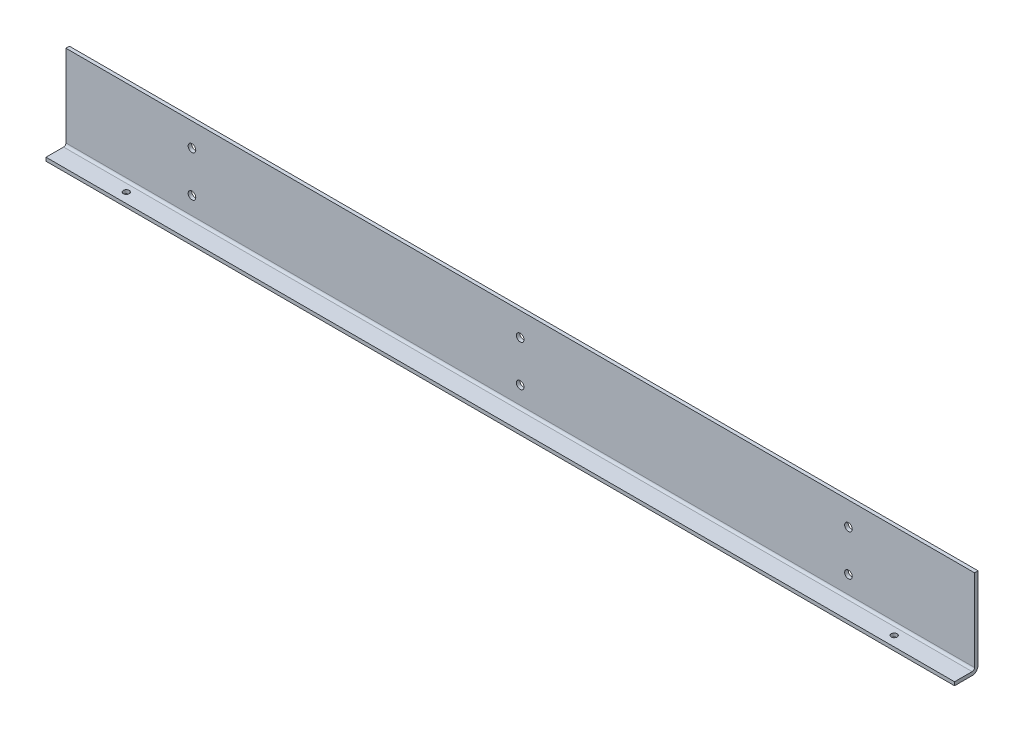
ISO-10303-21;
HEADER;
FILE_DESCRIPTION(('STEP AP214'),'2;1');
FILE_NAME('part.step','',(''),(''),'','','');
FILE_SCHEMA(('AUTOMOTIVE_DESIGN { 1 0 10303 214 1 1 1 1 }'));
ENDSEC;
DATA;
#1=APPLICATION_CONTEXT('core data for automotive mechanical design processes');
#2=APPLICATION_PROTOCOL_DEFINITION('international standard','automotive_design',2000,#1);
#3=PRODUCT_CONTEXT('',#1,'mechanical');
#4=PRODUCT('Part','Part','',(#3));
#5=PRODUCT_RELATED_PRODUCT_CATEGORY('part','',(#4));
#6=PRODUCT_DEFINITION_FORMATION('','',#4);
#7=PRODUCT_DEFINITION_CONTEXT('part definition',#1,'design');
#8=PRODUCT_DEFINITION('design','',#6,#7);
#9=PRODUCT_DEFINITION_SHAPE('','',#8);
#10=(LENGTH_UNIT() NAMED_UNIT(*) SI_UNIT(.MILLI.,.METRE.));
#11=(NAMED_UNIT(*) PLANE_ANGLE_UNIT() SI_UNIT($,.RADIAN.));
#12=(NAMED_UNIT(*) SI_UNIT($,.STERADIAN.) SOLID_ANGLE_UNIT());
#13=UNCERTAINTY_MEASURE_WITH_UNIT(LENGTH_MEASURE(1.E-05),#10,'distance_accuracy_value','');
#14=(GEOMETRIC_REPRESENTATION_CONTEXT(3) GLOBAL_UNCERTAINTY_ASSIGNED_CONTEXT((#13)) GLOBAL_UNIT_ASSIGNED_CONTEXT((#10,
#11,#12)) REPRESENTATION_CONTEXT('',''));
#15=CARTESIAN_POINT('',(0.,0.,0.));
#16=DIRECTION('',(0.,0.,1.));
#17=DIRECTION('',(1.,0.,0.));
#18=AXIS2_PLACEMENT_3D('',#15,#16,#17);
#19=CARTESIAN_POINT('',(0.,0.,3.));
#20=DIRECTION('',(1.,0.,0.));
#21=DIRECTION('',(0.,0.,-1.));
#22=AXIS2_PLACEMENT_3D('',#19,#20,#21);
#23=PLANE('',#22);
#24=DIRECTION('',(0.,-1.,0.));
#25=VECTOR('',#24,1.);
#26=CARTESIAN_POINT('',(0.,0.,0.));
#27=LINE('',#26,#25);
#28=CARTESIAN_POINT('',(0.,75.,0.));
#29=VERTEX_POINT('',#28);
#30=CARTESIAN_POINT('',(0.,5.,0.));
#31=VERTEX_POINT('',#30);
#32=EDGE_CURVE('E153',#29,#31,#27,.T.);
#33=ORIENTED_EDGE('',*,*,#32,.T.);
#34=CARTESIAN_POINT('',(0.,5.,5.));
#35=DIRECTION('',(1.,0.,0.));
#36=DIRECTION('',(0.,0.,-1.));
#37=AXIS2_PLACEMENT_3D('',#34,#35,#36);
#38=CIRCLE('',#37,5.);
#39=CARTESIAN_POINT('',(0.,0.,5.));
#40=VERTEX_POINT('',#39);
#41=EDGE_CURVE('E113',#31,#40,#38,.F.);
#42=ORIENTED_EDGE('',*,*,#41,.T.);
#43=DIRECTION('',(0.,0.,-1.));
#44=VECTOR('',#43,1.);
#45=CARTESIAN_POINT('',(0.,0.,3.));
#46=LINE('',#45,#44);
#47=CARTESIAN_POINT('',(0.,0.,20.));
#48=VERTEX_POINT('',#47);
#49=EDGE_CURVE('E108',#48,#40,#46,.T.);
#50=ORIENTED_EDGE('',*,*,#49,.F.);
#51=DIRECTION('',(0.,1.,0.));
#52=VECTOR('',#51,1.);
#53=CARTESIAN_POINT('',(0.,0.,20.));
#54=LINE('',#53,#52);
#55=CARTESIAN_POINT('',(0.,3.,20.));
#56=VERTEX_POINT('',#55);
#57=EDGE_CURVE('E111',#48,#56,#54,.T.);
#58=ORIENTED_EDGE('',*,*,#57,.T.);
#59=DIRECTION('',(0.,0.,-1.));
#60=VECTOR('',#59,1.);
#61=CARTESIAN_POINT('',(0.,3.,20.));
#62=LINE('',#61,#60);
#63=CARTESIAN_POINT('',(0.,3.,5.));
#64=VERTEX_POINT('',#63);
#65=EDGE_CURVE('E149',#56,#64,#62,.T.);
#66=ORIENTED_EDGE('',*,*,#65,.T.);
#67=CARTESIAN_POINT('',(0.,5.,5.));
#68=DIRECTION('',(1.,0.,0.));
#69=DIRECTION('',(0.,0.,-1.));
#70=AXIS2_PLACEMENT_3D('',#67,#68,#69);
#71=CIRCLE('',#70,2.);
#72=CARTESIAN_POINT('',(0.,5.,3.));
#73=VERTEX_POINT('',#72);
#74=EDGE_CURVE('E11',#64,#73,#71,.T.);
#75=ORIENTED_EDGE('',*,*,#74,.T.);
#76=DIRECTION('',(0.,-1.,0.));
#77=VECTOR('',#76,1.);
#78=CARTESIAN_POINT('',(0.,0.,3.));
#79=LINE('',#78,#77);
#80=CARTESIAN_POINT('',(0.,75.,3.));
#81=VERTEX_POINT('',#80);
#82=EDGE_CURVE('E156',#81,#73,#79,.T.);
#83=ORIENTED_EDGE('',*,*,#82,.F.);
#84=DIRECTION('',(0.,0.,-1.));
#85=VECTOR('',#84,1.);
#86=CARTESIAN_POINT('',(0.,75.,3.));
#87=LINE('',#86,#85);
#88=EDGE_CURVE('E167',#81,#29,#87,.T.);
#89=ORIENTED_EDGE('',*,*,#88,.T.);
#90=EDGE_LOOP('',(#33,#42,#50,#58,#66,#75,#83,#89));
#91=FACE_BOUND('',#90,.T.);
#92=ADVANCED_FACE('F44',(#91),#23,.F.);
#93=CARTESIAN_POINT('',(0.,0.,3.));
#94=DIRECTION('',(0.,1.,0.));
#95=DIRECTION('',(0.,0.,1.));
#96=AXIS2_PLACEMENT_3D('',#93,#94,#95);
#97=PLANE('',#96);
#98=CARTESIAN_POINT('',(60.,0.,11.5));
#99=DIRECTION('',(0.,1.,0.));
#100=DIRECTION('',(0.,0.,1.));
#101=AXIS2_PLACEMENT_3D('',#98,#99,#100);
#102=CIRCLE('',#101,2.5);
#103=CARTESIAN_POINT('',(60.,0.,14.));
#104=VERTEX_POINT('',#103);
#105=EDGE_CURVE('E443',#104,#104,#102,.T.);
#106=ORIENTED_EDGE('',*,*,#105,.T.);
#107=EDGE_LOOP('',(#106));
#108=FACE_BOUND('',#107,.T.);
#109=CARTESIAN_POINT('',(715.,0.,11.5));
#110=DIRECTION('',(0.,1.,0.));
#111=DIRECTION('',(0.,0.,1.));
#112=AXIS2_PLACEMENT_3D('',#109,#110,#111);
#113=CIRCLE('',#112,2.49999999999991);
#114=CARTESIAN_POINT('',(715.,0.,13.9999999999999));
#115=VERTEX_POINT('',#114);
#116=EDGE_CURVE('E445',#115,#115,#113,.T.);
#117=ORIENTED_EDGE('',*,*,#116,.T.);
#118=EDGE_LOOP('',(#117));
#119=FACE_BOUND('',#118,.T.);
#120=ORIENTED_EDGE('',*,*,#49,.T.);
#121=DIRECTION('',(1.,0.,0.));
#122=VECTOR('',#121,1.);
#123=CARTESIAN_POINT('',(775.,0.,5.));
#124=LINE('',#123,#122);
#125=CARTESIAN_POINT('',(775.,0.,5.));
#126=VERTEX_POINT('',#125);
#127=EDGE_CURVE('E119',#40,#126,#124,.T.);
#128=ORIENTED_EDGE('',*,*,#127,.T.);
#129=DIRECTION('',(0.,0.,-1.));
#130=VECTOR('',#129,1.);
#131=CARTESIAN_POINT('',(775.,0.,3.));
#132=LINE('',#131,#130);
#133=CARTESIAN_POINT('',(775.,0.,20.));
#134=VERTEX_POINT('',#133);
#135=EDGE_CURVE('E120',#134,#126,#132,.T.);
#136=ORIENTED_EDGE('',*,*,#135,.F.);
#137=DIRECTION('',(-1.,0.,0.));
#138=VECTOR('',#137,1.);
#139=CARTESIAN_POINT('',(0.,0.,20.));
#140=LINE('',#139,#138);
#141=EDGE_CURVE('E127',#134,#48,#140,.T.);
#142=ORIENTED_EDGE('',*,*,#141,.T.);
#143=EDGE_LOOP('',(#120,#128,#136,#142));
#144=FACE_BOUND('',#143,.T.);
#145=ADVANCED_FACE('F133',(#108,#119,#144),#97,.F.);
#146=CARTESIAN_POINT('',(775.,0.,3.));
#147=DIRECTION('',(-1.,0.,0.));
#148=DIRECTION('',(0.,0.,1.));
#149=AXIS2_PLACEMENT_3D('',#146,#147,#148);
#150=PLANE('',#149);
#151=ORIENTED_EDGE('',*,*,#135,.T.);
#152=CARTESIAN_POINT('',(775.,5.,5.));
#153=DIRECTION('',(-1.,0.,0.));
#154=DIRECTION('',(0.,0.,1.));
#155=AXIS2_PLACEMENT_3D('',#152,#153,#154);
#156=CIRCLE('',#155,5.);
#157=CARTESIAN_POINT('',(775.,5.,0.));
#158=VERTEX_POINT('',#157);
#159=EDGE_CURVE('E186',#126,#158,#156,.F.);
#160=ORIENTED_EDGE('',*,*,#159,.T.);
#161=DIRECTION('',(0.,1.,0.));
#162=VECTOR('',#161,1.);
#163=CARTESIAN_POINT('',(775.,0.,0.));
#164=LINE('',#163,#162);
#165=CARTESIAN_POINT('',(775.,75.,0.));
#166=VERTEX_POINT('',#165);
#167=EDGE_CURVE('E170',#158,#166,#164,.T.);
#168=ORIENTED_EDGE('',*,*,#167,.T.);
#169=DIRECTION('',(0.,0.,-1.));
#170=VECTOR('',#169,1.);
#171=CARTESIAN_POINT('',(775.,75.,3.));
#172=LINE('',#171,#170);
#173=CARTESIAN_POINT('',(775.,75.,3.));
#174=VERTEX_POINT('',#173);
#175=EDGE_CURVE('E178',#174,#166,#172,.T.);
#176=ORIENTED_EDGE('',*,*,#175,.F.);
#177=DIRECTION('',(0.,1.,0.));
#178=VECTOR('',#177,1.);
#179=CARTESIAN_POINT('',(775.,0.,3.));
#180=LINE('',#179,#178);
#181=CARTESIAN_POINT('',(775.,5.,3.));
#182=VERTEX_POINT('',#181);
#183=EDGE_CURVE('E160',#182,#174,#180,.T.);
#184=ORIENTED_EDGE('',*,*,#183,.F.);
#185=CARTESIAN_POINT('',(775.,5.,5.));
#186=DIRECTION('',(-1.,0.,0.));
#187=DIRECTION('',(0.,0.,1.));
#188=AXIS2_PLACEMENT_3D('',#185,#186,#187);
#189=CIRCLE('',#188,2.);
#190=CARTESIAN_POINT('',(775.,3.,5.));
#191=VERTEX_POINT('',#190);
#192=EDGE_CURVE('E53',#182,#191,#189,.T.);
#193=ORIENTED_EDGE('',*,*,#192,.T.);
#194=DIRECTION('',(0.,0.,-1.));
#195=VECTOR('',#194,1.);
#196=CARTESIAN_POINT('',(775.,3.,20.));
#197=LINE('',#196,#195);
#198=CARTESIAN_POINT('',(775.,3.,20.));
#199=VERTEX_POINT('',#198);
#200=EDGE_CURVE('E150',#199,#191,#197,.T.);
#201=ORIENTED_EDGE('',*,*,#200,.F.);
#202=DIRECTION('',(0.,-1.,0.));
#203=VECTOR('',#202,1.);
#204=CARTESIAN_POINT('',(775.,0.,20.));
#205=LINE('',#204,#203);
#206=EDGE_CURVE('E146',#199,#134,#205,.T.);
#207=ORIENTED_EDGE('',*,*,#206,.T.);
#208=EDGE_LOOP('',(#151,#160,#168,#176,#184,#193,#201,#207));
#209=FACE_BOUND('',#208,.T.);
#210=ADVANCED_FACE('F207',(#209),#150,.F.);
#211=CARTESIAN_POINT('',(0.,75.,3.));
#212=DIRECTION('',(0.,-1.,0.));
#213=DIRECTION('',(0.,0.,-1.));
#214=AXIS2_PLACEMENT_3D('',#211,#212,#213);
#215=PLANE('',#214);
#216=DIRECTION('',(-1.,0.,0.));
#217=VECTOR('',#216,1.);
#218=CARTESIAN_POINT('',(0.,75.,0.));
#219=LINE('',#218,#217);
#220=EDGE_CURVE('E161',#166,#29,#219,.T.);
#221=ORIENTED_EDGE('',*,*,#220,.T.);
#222=ORIENTED_EDGE('',*,*,#88,.F.);
#223=DIRECTION('',(-1.,0.,0.));
#224=VECTOR('',#223,1.);
#225=CARTESIAN_POINT('',(0.,75.,3.));
#226=LINE('',#225,#224);
#227=EDGE_CURVE('E164',#174,#81,#226,.T.);
#228=ORIENTED_EDGE('',*,*,#227,.F.);
#229=ORIENTED_EDGE('',*,*,#175,.T.);
#230=EDGE_LOOP('',(#221,#222,#228,#229));
#231=FACE_BOUND('',#230,.T.);
#232=ADVANCED_FACE('F213',(#231),#215,.F.);
#233=CARTESIAN_POINT('',(0.,0.,3.));
#234=DIRECTION('',(0.,0.,-1.));
#235=DIRECTION('',(-1.,0.,0.));
#236=AXIS2_PLACEMENT_3D('',#233,#234,#235);
#237=PLANE('',#236);
#238=CARTESIAN_POINT('',(667.5,55.,3.));
#239=DIRECTION('',(0.,0.,1.));
#240=DIRECTION('',(1.,0.,0.));
#241=AXIS2_PLACEMENT_3D('',#238,#239,#240);
#242=CIRCLE('',#241,3.24999999999995);
#243=CARTESIAN_POINT('',(670.75,55.,3.));
#244=VERTEX_POINT('',#243);
#245=EDGE_CURVE('E424',#244,#244,#242,.T.);
#246=ORIENTED_EDGE('',*,*,#245,.F.);
#247=EDGE_LOOP('',(#246));
#248=FACE_BOUND('',#247,.T.);
#249=CARTESIAN_POINT('',(387.5,20.,3.));
#250=DIRECTION('',(0.,0.,1.));
#251=DIRECTION('',(1.,0.,0.));
#252=AXIS2_PLACEMENT_3D('',#249,#250,#251);
#253=CIRCLE('',#252,3.24999999999995);
#254=CARTESIAN_POINT('',(390.75,20.,3.));
#255=VERTEX_POINT('',#254);
#256=EDGE_CURVE('E413',#255,#255,#253,.T.);
#257=ORIENTED_EDGE('',*,*,#256,.F.);
#258=EDGE_LOOP('',(#257));
#259=FACE_BOUND('',#258,.T.);
#260=CARTESIAN_POINT('',(387.5,55.,3.));
#261=DIRECTION('',(0.,0.,1.));
#262=DIRECTION('',(1.,0.,0.));
#263=AXIS2_PLACEMENT_3D('',#260,#261,#262);
#264=CIRCLE('',#263,3.24999999999995);
#265=CARTESIAN_POINT('',(390.75,55.,3.));
#266=VERTEX_POINT('',#265);
#267=EDGE_CURVE('E401',#266,#266,#264,.T.);
#268=ORIENTED_EDGE('',*,*,#267,.F.);
#269=EDGE_LOOP('',(#268));
#270=FACE_BOUND('',#269,.T.);
#271=CARTESIAN_POINT('',(107.5,20.,3.));
#272=DIRECTION('',(0.,0.,1.));
#273=DIRECTION('',(1.,0.,0.));
#274=AXIS2_PLACEMENT_3D('',#271,#272,#273);
#275=CIRCLE('',#274,3.25000000000001);
#276=CARTESIAN_POINT('',(110.75,20.,3.));
#277=VERTEX_POINT('',#276);
#278=EDGE_CURVE('E392',#277,#277,#275,.T.);
#279=ORIENTED_EDGE('',*,*,#278,.F.);
#280=EDGE_LOOP('',(#279));
#281=FACE_BOUND('',#280,.T.);
#282=CARTESIAN_POINT('',(667.5,20.,3.));
#283=DIRECTION('',(0.,0.,1.));
#284=DIRECTION('',(1.,0.,0.));
#285=AXIS2_PLACEMENT_3D('',#282,#283,#284);
#286=CIRCLE('',#285,3.24999999999995);
#287=CARTESIAN_POINT('',(670.75,20.,3.));
#288=VERTEX_POINT('',#287);
#289=EDGE_CURVE('E435',#288,#288,#286,.T.);
#290=ORIENTED_EDGE('',*,*,#289,.F.);
#291=EDGE_LOOP('',(#290));
#292=FACE_BOUND('',#291,.T.);
#293=CARTESIAN_POINT('',(107.5,55.,3.));
#294=DIRECTION('',(0.,0.,1.));
#295=DIRECTION('',(1.,0.,0.));
#296=AXIS2_PLACEMENT_3D('',#293,#294,#295);
#297=CIRCLE('',#296,3.25000000000001);
#298=CARTESIAN_POINT('',(110.75,55.,3.));
#299=VERTEX_POINT('',#298);
#300=EDGE_CURVE('E140',#299,#299,#297,.T.);
#301=ORIENTED_EDGE('',*,*,#300,.F.);
#302=EDGE_LOOP('',(#301));
#303=FACE_BOUND('',#302,.T.);
#304=ORIENTED_EDGE('',*,*,#82,.T.);
#305=DIRECTION('',(1.,0.,0.));
#306=VECTOR('',#305,1.);
#307=CARTESIAN_POINT('',(0.,5.,3.));
#308=LINE('',#307,#306);
#309=EDGE_CURVE('E194',#73,#182,#308,.T.);
#310=ORIENTED_EDGE('',*,*,#309,.T.);
#311=ORIENTED_EDGE('',*,*,#183,.T.);
#312=ORIENTED_EDGE('',*,*,#227,.T.);
#313=EDGE_LOOP('',(#304,#310,#311,#312));
#314=FACE_BOUND('',#313,.T.);
#315=ADVANCED_FACE('F202',(#248,#259,#270,#281,#292,#303,#314),#237,.F.);
#316=CARTESIAN_POINT('',(0.,0.,0.));
#317=DIRECTION('',(0.,0.,-1.));
#318=DIRECTION('',(-1.,0.,0.));
#319=AXIS2_PLACEMENT_3D('',#316,#317,#318);
#320=PLANE('',#319);
#321=CARTESIAN_POINT('',(667.5,55.,0.));
#322=DIRECTION('',(0.,0.,1.));
#323=DIRECTION('',(1.,0.,0.));
#324=AXIS2_PLACEMENT_3D('',#321,#322,#323);
#325=CIRCLE('',#324,3.24999999999995);
#326=CARTESIAN_POINT('',(670.75,55.,0.));
#327=VERTEX_POINT('',#326);
#328=EDGE_CURVE('E404',#327,#327,#325,.T.);
#329=ORIENTED_EDGE('',*,*,#328,.T.);
#330=EDGE_LOOP('',(#329));
#331=FACE_BOUND('',#330,.T.);
#332=CARTESIAN_POINT('',(387.5,20.,0.));
#333=DIRECTION('',(0.,0.,1.));
#334=DIRECTION('',(1.,0.,0.));
#335=AXIS2_PLACEMENT_3D('',#332,#333,#334);
#336=CIRCLE('',#335,3.24999999999995);
#337=CARTESIAN_POINT('',(390.75,20.,0.));
#338=VERTEX_POINT('',#337);
#339=EDGE_CURVE('E418',#338,#338,#336,.T.);
#340=ORIENTED_EDGE('',*,*,#339,.T.);
#341=EDGE_LOOP('',(#340));
#342=FACE_BOUND('',#341,.T.);
#343=CARTESIAN_POINT('',(387.5,55.,0.));
#344=DIRECTION('',(0.,0.,1.));
#345=DIRECTION('',(1.,0.,0.));
#346=AXIS2_PLACEMENT_3D('',#343,#344,#345);
#347=CIRCLE('',#346,3.24999999999995);
#348=CARTESIAN_POINT('',(390.75,55.,0.));
#349=VERTEX_POINT('',#348);
#350=EDGE_CURVE('E410',#349,#349,#347,.T.);
#351=ORIENTED_EDGE('',*,*,#350,.T.);
#352=EDGE_LOOP('',(#351));
#353=FACE_BOUND('',#352,.T.);
#354=CARTESIAN_POINT('',(107.5,20.,0.));
#355=DIRECTION('',(0.,0.,1.));
#356=DIRECTION('',(1.,0.,0.));
#357=AXIS2_PLACEMENT_3D('',#354,#355,#356);
#358=CIRCLE('',#357,3.25000000000001);
#359=CARTESIAN_POINT('',(110.75,20.,0.));
#360=VERTEX_POINT('',#359);
#361=EDGE_CURVE('E395',#360,#360,#358,.T.);
#362=ORIENTED_EDGE('',*,*,#361,.T.);
#363=EDGE_LOOP('',(#362));
#364=FACE_BOUND('',#363,.T.);
#365=CARTESIAN_POINT('',(667.5,20.,0.));
#366=DIRECTION('',(0.,0.,1.));
#367=DIRECTION('',(1.,0.,0.));
#368=AXIS2_PLACEMENT_3D('',#365,#366,#367);
#369=CIRCLE('',#368,3.24999999999995);
#370=CARTESIAN_POINT('',(670.75,20.,0.));
#371=VERTEX_POINT('',#370);
#372=EDGE_CURVE('E427',#371,#371,#369,.T.);
#373=ORIENTED_EDGE('',*,*,#372,.T.);
#374=EDGE_LOOP('',(#373));
#375=FACE_BOUND('',#374,.T.);
#376=CARTESIAN_POINT('',(107.5,55.,0.));
#377=DIRECTION('',(0.,0.,1.));
#378=DIRECTION('',(1.,0.,0.));
#379=AXIS2_PLACEMENT_3D('',#376,#377,#378);
#380=CIRCLE('',#379,3.25000000000001);
#381=CARTESIAN_POINT('',(110.75,55.,0.));
#382=VERTEX_POINT('',#381);
#383=EDGE_CURVE('E136',#382,#382,#380,.T.);
#384=ORIENTED_EDGE('',*,*,#383,.T.);
#385=EDGE_LOOP('',(#384));
#386=FACE_BOUND('',#385,.T.);
#387=ORIENTED_EDGE('',*,*,#167,.F.);
#388=DIRECTION('',(1.,0.,0.));
#389=VECTOR('',#388,1.);
#390=CARTESIAN_POINT('',(0.,5.,0.));
#391=LINE('',#390,#389);
#392=EDGE_CURVE('E189',#158,#31,#391,.F.);
#393=ORIENTED_EDGE('',*,*,#392,.T.);
#394=ORIENTED_EDGE('',*,*,#32,.F.);
#395=ORIENTED_EDGE('',*,*,#220,.F.);
#396=EDGE_LOOP('',(#387,#393,#394,#395));
#397=FACE_BOUND('',#396,.T.);
#398=ADVANCED_FACE('F249',(#331,#342,#353,#364,#375,#386,#397),#320,.T.);
#399=CARTESIAN_POINT('',(0.,3.,20.));
#400=DIRECTION('',(0.,1.,0.));
#401=DIRECTION('',(0.,0.,1.));
#402=AXIS2_PLACEMENT_3D('',#399,#400,#401);
#403=PLANE('',#402);
#404=CARTESIAN_POINT('',(60.,3.,11.5));
#405=DIRECTION('',(0.,1.,0.));
#406=DIRECTION('',(0.,0.,1.));
#407=AXIS2_PLACEMENT_3D('',#404,#405,#406);
#408=CIRCLE('',#407,2.5);
#409=CARTESIAN_POINT('',(60.,3.,14.));
#410=VERTEX_POINT('',#409);
#411=EDGE_CURVE('E453',#410,#410,#408,.T.);
#412=ORIENTED_EDGE('',*,*,#411,.F.);
#413=EDGE_LOOP('',(#412));
#414=FACE_BOUND('',#413,.T.);
#415=CARTESIAN_POINT('',(715.,3.,11.5));
#416=DIRECTION('',(0.,1.,0.));
#417=DIRECTION('',(0.,0.,1.));
#418=AXIS2_PLACEMENT_3D('',#415,#416,#417);
#419=CIRCLE('',#418,2.49999999999991);
#420=CARTESIAN_POINT('',(715.,3.,13.9999999999999));
#421=VERTEX_POINT('',#420);
#422=EDGE_CURVE('E449',#421,#421,#419,.T.);
#423=ORIENTED_EDGE('',*,*,#422,.F.);
#424=EDGE_LOOP('',(#423));
#425=FACE_BOUND('',#424,.T.);
#426=ORIENTED_EDGE('',*,*,#200,.T.);
#427=DIRECTION('',(1.,0.,0.));
#428=VECTOR('',#427,1.);
#429=CARTESIAN_POINT('',(0.,3.,5.));
#430=LINE('',#429,#428);
#431=EDGE_CURVE('E66',#191,#64,#430,.F.);
#432=ORIENTED_EDGE('',*,*,#431,.T.);
#433=ORIENTED_EDGE('',*,*,#65,.F.);
#434=DIRECTION('',(1.,0.,0.));
#435=VECTOR('',#434,1.);
#436=CARTESIAN_POINT('',(0.,3.,20.));
#437=LINE('',#436,#435);
#438=EDGE_CURVE('E130',#56,#199,#437,.T.);
#439=ORIENTED_EDGE('',*,*,#438,.T.);
#440=EDGE_LOOP('',(#426,#432,#433,#439));
#441=FACE_BOUND('',#440,.T.);
#442=ADVANCED_FACE('F248',(#414,#425,#441),#403,.T.);
#443=CARTESIAN_POINT('',(0.,0.,20.));
#444=DIRECTION('',(0.,0.,-1.));
#445=DIRECTION('',(-1.,0.,0.));
#446=AXIS2_PLACEMENT_3D('',#443,#444,#445);
#447=PLANE('',#446);
#448=ORIENTED_EDGE('',*,*,#141,.F.);
#449=ORIENTED_EDGE('',*,*,#206,.F.);
#450=ORIENTED_EDGE('',*,*,#438,.F.);
#451=ORIENTED_EDGE('',*,*,#57,.F.);
#452=EDGE_LOOP('',(#448,#449,#450,#451));
#453=FACE_BOUND('',#452,.T.);
#454=ADVANCED_FACE('F125',(#453),#447,.F.);
#455=CARTESIAN_POINT('',(107.5,55.,0.));
#456=DIRECTION('',(0.,0.,1.));
#457=DIRECTION('',(1.,0.,0.));
#458=AXIS2_PLACEMENT_3D('',#455,#456,#457);
#459=CYLINDRICAL_SURFACE('',#458,3.25000000000001);
#460=ORIENTED_EDGE('',*,*,#383,.F.);
#461=EDGE_LOOP('',(#460));
#462=FACE_BOUND('',#461,.T.);
#463=ORIENTED_EDGE('',*,*,#300,.T.);
#464=EDGE_LOOP('',(#463));
#465=FACE_BOUND('',#464,.T.);
#466=ADVANCED_FACE('F256',(#462,#465),#459,.F.);
#467=CARTESIAN_POINT('',(667.5,20.,0.));
#468=DIRECTION('',(0.,0.,1.));
#469=DIRECTION('',(1.,0.,0.));
#470=AXIS2_PLACEMENT_3D('',#467,#468,#469);
#471=CYLINDRICAL_SURFACE('',#470,3.24999999999995);
#472=ORIENTED_EDGE('',*,*,#372,.F.);
#473=EDGE_LOOP('',(#472));
#474=FACE_BOUND('',#473,.T.);
#475=ORIENTED_EDGE('',*,*,#289,.T.);
#476=EDGE_LOOP('',(#475));
#477=FACE_BOUND('',#476,.T.);
#478=ADVANCED_FACE('F351',(#474,#477),#471,.F.);
#479=CARTESIAN_POINT('',(107.5,20.,0.));
#480=DIRECTION('',(0.,0.,1.));
#481=DIRECTION('',(1.,0.,0.));
#482=AXIS2_PLACEMENT_3D('',#479,#480,#481);
#483=CYLINDRICAL_SURFACE('',#482,3.25000000000001);
#484=ORIENTED_EDGE('',*,*,#361,.F.);
#485=EDGE_LOOP('',(#484));
#486=FACE_BOUND('',#485,.T.);
#487=ORIENTED_EDGE('',*,*,#278,.T.);
#488=EDGE_LOOP('',(#487));
#489=FACE_BOUND('',#488,.T.);
#490=ADVANCED_FACE('F342',(#486,#489),#483,.F.);
#491=CARTESIAN_POINT('',(387.5,55.,0.));
#492=DIRECTION('',(0.,0.,1.));
#493=DIRECTION('',(1.,0.,0.));
#494=AXIS2_PLACEMENT_3D('',#491,#492,#493);
#495=CYLINDRICAL_SURFACE('',#494,3.24999999999995);
#496=ORIENTED_EDGE('',*,*,#350,.F.);
#497=EDGE_LOOP('',(#496));
#498=FACE_BOUND('',#497,.T.);
#499=ORIENTED_EDGE('',*,*,#267,.T.);
#500=EDGE_LOOP('',(#499));
#501=FACE_BOUND('',#500,.T.);
#502=ADVANCED_FACE('F333',(#498,#501),#495,.F.);
#503=CARTESIAN_POINT('',(387.5,20.,0.));
#504=DIRECTION('',(0.,0.,1.));
#505=DIRECTION('',(1.,0.,0.));
#506=AXIS2_PLACEMENT_3D('',#503,#504,#505);
#507=CYLINDRICAL_SURFACE('',#506,3.24999999999995);
#508=ORIENTED_EDGE('',*,*,#339,.F.);
#509=EDGE_LOOP('',(#508));
#510=FACE_BOUND('',#509,.T.);
#511=ORIENTED_EDGE('',*,*,#256,.T.);
#512=EDGE_LOOP('',(#511));
#513=FACE_BOUND('',#512,.T.);
#514=ADVANCED_FACE('F244',(#510,#513),#507,.F.);
#515=CARTESIAN_POINT('',(667.5,55.,0.));
#516=DIRECTION('',(0.,0.,1.));
#517=DIRECTION('',(1.,0.,0.));
#518=AXIS2_PLACEMENT_3D('',#515,#516,#517);
#519=CYLINDRICAL_SURFACE('',#518,3.24999999999995);
#520=ORIENTED_EDGE('',*,*,#328,.F.);
#521=EDGE_LOOP('',(#520));
#522=FACE_BOUND('',#521,.T.);
#523=ORIENTED_EDGE('',*,*,#245,.T.);
#524=EDGE_LOOP('',(#523));
#525=FACE_BOUND('',#524,.T.);
#526=ADVANCED_FACE('F235',(#522,#525),#519,.F.);
#527=CARTESIAN_POINT('',(0.,5.,5.));
#528=DIRECTION('',(-1.,0.,0.));
#529=DIRECTION('',(0.,0.,1.));
#530=AXIS2_PLACEMENT_3D('',#527,#528,#529);
#531=CYLINDRICAL_SURFACE('',#530,5.);
#532=ORIENTED_EDGE('',*,*,#41,.F.);
#533=ORIENTED_EDGE('',*,*,#392,.F.);
#534=ORIENTED_EDGE('',*,*,#159,.F.);
#535=ORIENTED_EDGE('',*,*,#127,.F.);
#536=EDGE_LOOP('',(#532,#533,#534,#535));
#537=FACE_BOUND('',#536,.T.);
#538=ADVANCED_FACE('F233',(#537),#531,.T.);
#539=CARTESIAN_POINT('',(715.,0.,11.5));
#540=DIRECTION('',(0.,1.,0.));
#541=DIRECTION('',(0.,0.,1.));
#542=AXIS2_PLACEMENT_3D('',#539,#540,#541);
#543=CYLINDRICAL_SURFACE('',#542,2.49999999999991);
#544=ORIENTED_EDGE('',*,*,#116,.F.);
#545=EDGE_LOOP('',(#544));
#546=FACE_BOUND('',#545,.T.);
#547=ORIENTED_EDGE('',*,*,#422,.T.);
#548=EDGE_LOOP('',(#547));
#549=FACE_BOUND('',#548,.T.);
#550=ADVANCED_FACE('F221',(#546,#549),#543,.F.);
#551=CARTESIAN_POINT('',(60.,0.,11.5));
#552=DIRECTION('',(0.,1.,0.));
#553=DIRECTION('',(0.,0.,1.));
#554=AXIS2_PLACEMENT_3D('',#551,#552,#553);
#555=CYLINDRICAL_SURFACE('',#554,2.5);
#556=ORIENTED_EDGE('',*,*,#105,.F.);
#557=EDGE_LOOP('',(#556));
#558=FACE_BOUND('',#557,.T.);
#559=ORIENTED_EDGE('',*,*,#411,.T.);
#560=EDGE_LOOP('',(#559));
#561=FACE_BOUND('',#560,.T.);
#562=ADVANCED_FACE('F216',(#558,#561),#555,.F.);
#563=CARTESIAN_POINT('',(0.,5.,5.));
#564=DIRECTION('',(1.,0.,0.));
#565=DIRECTION('',(0.,0.,-1.));
#566=AXIS2_PLACEMENT_3D('',#563,#564,#565);
#567=CYLINDRICAL_SURFACE('',#566,2.);
#568=ORIENTED_EDGE('',*,*,#74,.F.);
#569=ORIENTED_EDGE('',*,*,#431,.F.);
#570=ORIENTED_EDGE('',*,*,#192,.F.);
#571=ORIENTED_EDGE('',*,*,#309,.F.);
#572=EDGE_LOOP('',(#568,#569,#570,#571));
#573=FACE_BOUND('',#572,.T.);
#574=ADVANCED_FACE('F46',(#573),#567,.F.);
#575=CLOSED_SHELL('',(#92,#145,#210,#232,#315,#398,#442,#454,#466,#478,#490,#502,#514,#526,#538,
#550,#562,#574));
#576=MANIFOLD_SOLID_BREP('B2',#575);
#577=ADVANCED_BREP_SHAPE_REPRESENTATION('',(#18,#576),#14);
#578=SHAPE_DEFINITION_REPRESENTATION(#9,#577);
ENDSEC;
END-ISO-10303-21;
